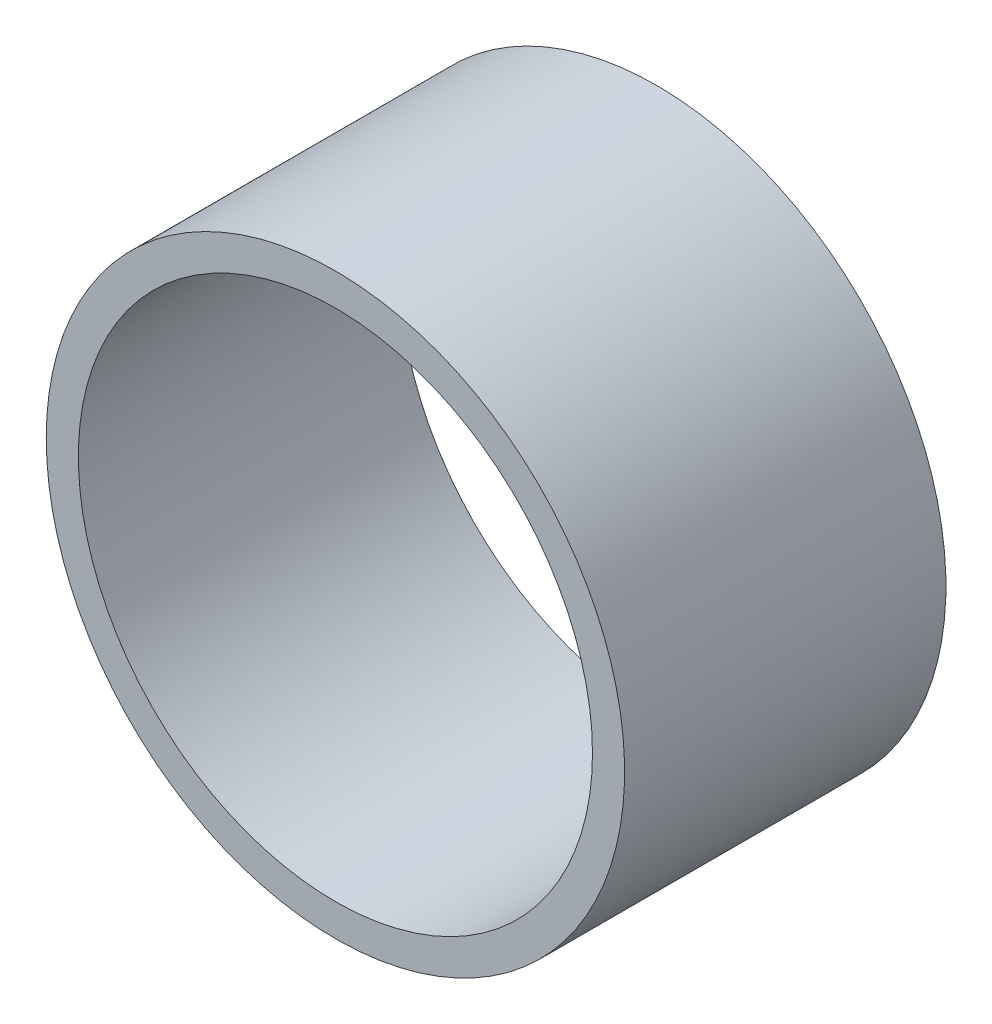
ISO-10303-21;
HEADER;
FILE_DESCRIPTION(('STEP AP214'),'2;1');
FILE_NAME('part.step','',(''),(''),'','','');
FILE_SCHEMA(('AUTOMOTIVE_DESIGN { 1 0 10303 214 1 1 1 1 }'));
ENDSEC;
DATA;
#1=APPLICATION_CONTEXT('core data for automotive mechanical design processes');
#2=APPLICATION_PROTOCOL_DEFINITION('international standard','automotive_design',2000,#1);
#3=PRODUCT_CONTEXT('',#1,'mechanical');
#4=PRODUCT('Part','Part','',(#3));
#5=PRODUCT_RELATED_PRODUCT_CATEGORY('part','',(#4));
#6=PRODUCT_DEFINITION_FORMATION('','',#4);
#7=PRODUCT_DEFINITION_CONTEXT('part definition',#1,'design');
#8=PRODUCT_DEFINITION('design','',#6,#7);
#9=PRODUCT_DEFINITION_SHAPE('','',#8);
#10=(LENGTH_UNIT() NAMED_UNIT(*) SI_UNIT(.MILLI.,.METRE.));
#11=(NAMED_UNIT(*) PLANE_ANGLE_UNIT() SI_UNIT($,.RADIAN.));
#12=(NAMED_UNIT(*) SI_UNIT($,.STERADIAN.) SOLID_ANGLE_UNIT());
#13=UNCERTAINTY_MEASURE_WITH_UNIT(LENGTH_MEASURE(1.E-05),#10,'distance_accuracy_value','');
#14=(GEOMETRIC_REPRESENTATION_CONTEXT(3) GLOBAL_UNCERTAINTY_ASSIGNED_CONTEXT((#13)) GLOBAL_UNIT_ASSIGNED_CONTEXT((#10,
#11,#12)) REPRESENTATION_CONTEXT('',''));
#15=CARTESIAN_POINT('',(0.,0.,0.));
#16=DIRECTION('',(0.,0.,1.));
#17=DIRECTION('',(1.,0.,0.));
#18=AXIS2_PLACEMENT_3D('',#15,#16,#17);
#19=CARTESIAN_POINT('',(-35.56,0.,0.));
#20=DIRECTION('',(0.,0.,1.));
#21=DIRECTION('',(1.,0.,0.));
#22=AXIS2_PLACEMENT_3D('',#19,#20,#21);
#23=PLANE('',#22);
#24=CARTESIAN_POINT('',(-35.56,0.,0.));
#25=DIRECTION('',(0.,0.,-1.));
#26=DIRECTION('',(-1.,0.,0.));
#27=AXIS2_PLACEMENT_3D('',#24,#25,#26);
#28=CIRCLE('',#27,20.32);
#29=CARTESIAN_POINT('',(-15.24,0.,0.));
#30=VERTEX_POINT('',#29);
#31=EDGE_CURVE('E50',#30,#30,#28,.T.);
#32=ORIENTED_EDGE('',*,*,#31,.F.);
#33=EDGE_LOOP('',(#32));
#34=FACE_BOUND('',#33,.T.);
#35=CARTESIAN_POINT('',(-35.56,0.,0.));
#36=DIRECTION('',(0.,0.,1.));
#37=DIRECTION('',(1.,0.,0.));
#38=AXIS2_PLACEMENT_3D('',#35,#36,#37);
#39=CIRCLE('',#38,22.86);
#40=CARTESIAN_POINT('',(-58.42,0.,0.));
#41=VERTEX_POINT('',#40);
#42=EDGE_CURVE('E11',#41,#41,#39,.T.);
#43=ORIENTED_EDGE('',*,*,#42,.F.);
#44=EDGE_LOOP('',(#43));
#45=FACE_BOUND('',#44,.T.);
#46=ADVANCED_FACE('F16',(#34,#45),#23,.F.);
#47=CARTESIAN_POINT('',(-35.56,0.,25.4));
#48=DIRECTION('',(0.,0.,1.));
#49=DIRECTION('',(1.,0.,0.));
#50=AXIS2_PLACEMENT_3D('',#47,#48,#49);
#51=PLANE('',#50);
#52=CARTESIAN_POINT('',(-35.56,0.,25.4));
#53=DIRECTION('',(0.,0.,-1.));
#54=DIRECTION('',(-1.,0.,0.));
#55=AXIS2_PLACEMENT_3D('',#52,#53,#54);
#56=CIRCLE('',#55,20.32);
#57=CARTESIAN_POINT('',(-15.24,0.,25.4));
#58=VERTEX_POINT('',#57);
#59=EDGE_CURVE('E63',#58,#58,#56,.T.);
#60=ORIENTED_EDGE('',*,*,#59,.T.);
#61=EDGE_LOOP('',(#60));
#62=FACE_BOUND('',#61,.T.);
#63=CARTESIAN_POINT('',(-35.56,0.,25.4));
#64=DIRECTION('',(0.,0.,1.));
#65=DIRECTION('',(1.,0.,0.));
#66=AXIS2_PLACEMENT_3D('',#63,#64,#65);
#67=CIRCLE('',#66,22.86);
#68=CARTESIAN_POINT('',(-58.42,0.,25.4));
#69=VERTEX_POINT('',#68);
#70=EDGE_CURVE('E20',#69,#69,#67,.T.);
#71=ORIENTED_EDGE('',*,*,#70,.T.);
#72=EDGE_LOOP('',(#71));
#73=FACE_BOUND('',#72,.T.);
#74=ADVANCED_FACE('F71',(#62,#73),#51,.T.);
#75=CARTESIAN_POINT('',(-35.56,0.,0.));
#76=DIRECTION('',(0.,0.,1.));
#77=DIRECTION('',(1.,0.,0.));
#78=AXIS2_PLACEMENT_3D('',#75,#76,#77);
#79=CYLINDRICAL_SURFACE('',#78,22.86);
#80=ORIENTED_EDGE('',*,*,#70,.F.);
#81=DIRECTION('',(0.,0.,-1.));
#82=VECTOR('',#81,1.);
#83=CARTESIAN_POINT('',(-58.42,0.,0.));
#84=LINE('',#83,#82);
#85=EDGE_CURVE('E27',#69,#41,#84,.T.);
#86=ORIENTED_EDGE('',*,*,#85,.T.);
#87=ORIENTED_EDGE('',*,*,#42,.T.);
#88=ORIENTED_EDGE('',*,*,#85,.F.);
#89=EDGE_LOOP('',(#80,#86,#87,#88));
#90=FACE_BOUND('',#89,.T.);
#91=ADVANCED_FACE('F69',(#90),#79,.T.);
#92=CARTESIAN_POINT('',(-35.56,0.,0.));
#93=DIRECTION('',(0.,0.,1.));
#94=DIRECTION('',(-1.,0.,0.));
#95=AXIS2_PLACEMENT_3D('',#92,#93,#94);
#96=CYLINDRICAL_SURFACE('',#95,20.32);
#97=ORIENTED_EDGE('',*,*,#59,.F.);
#98=DIRECTION('',(0.,0.,-1.));
#99=VECTOR('',#98,1.);
#100=CARTESIAN_POINT('',(-15.24,0.,0.));
#101=LINE('',#100,#99);
#102=EDGE_CURVE('E52',#58,#30,#101,.T.);
#103=ORIENTED_EDGE('',*,*,#102,.T.);
#104=ORIENTED_EDGE('',*,*,#31,.T.);
#105=ORIENTED_EDGE('',*,*,#102,.F.);
#106=EDGE_LOOP('',(#97,#103,#104,#105));
#107=FACE_BOUND('',#106,.T.);
#108=ADVANCED_FACE('F18',(#107),#96,.F.);
#109=CLOSED_SHELL('',(#46,#74,#91,#108));
#110=MANIFOLD_SOLID_BREP('B1',#109);
#111=ADVANCED_BREP_SHAPE_REPRESENTATION('',(#18,#110),#14);
#112=SHAPE_DEFINITION_REPRESENTATION(#9,#111);
ENDSEC;
END-ISO-10303-21;
